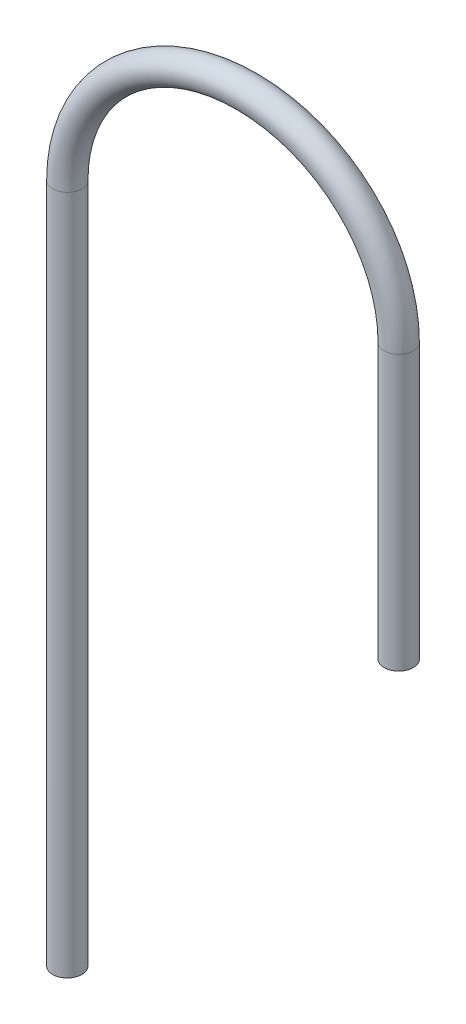
ISO-10303-21;
HEADER;
FILE_DESCRIPTION(('STEP AP214'),'2;1');
FILE_NAME('part.step','',(''),(''),'','','');
FILE_SCHEMA(('AUTOMOTIVE_DESIGN { 1 0 10303 214 1 1 1 1 }'));
ENDSEC;
DATA;
#1=APPLICATION_CONTEXT('core data for automotive mechanical design processes');
#2=APPLICATION_PROTOCOL_DEFINITION('international standard','automotive_design',2000,#1);
#3=PRODUCT_CONTEXT('',#1,'mechanical');
#4=PRODUCT('Part','Part','',(#3));
#5=PRODUCT_RELATED_PRODUCT_CATEGORY('part','',(#4));
#6=PRODUCT_DEFINITION_FORMATION('','',#4);
#7=PRODUCT_DEFINITION_CONTEXT('part definition',#1,'design');
#8=PRODUCT_DEFINITION('design','',#6,#7);
#9=PRODUCT_DEFINITION_SHAPE('','',#8);
#10=(LENGTH_UNIT() NAMED_UNIT(*) SI_UNIT(.MILLI.,.METRE.));
#11=(NAMED_UNIT(*) PLANE_ANGLE_UNIT() SI_UNIT($,.RADIAN.));
#12=(NAMED_UNIT(*) SI_UNIT($,.STERADIAN.) SOLID_ANGLE_UNIT());
#13=UNCERTAINTY_MEASURE_WITH_UNIT(LENGTH_MEASURE(1.E-05),#10,'distance_accuracy_value','');
#14=(GEOMETRIC_REPRESENTATION_CONTEXT(3) GLOBAL_UNCERTAINTY_ASSIGNED_CONTEXT((#13)) GLOBAL_UNIT_ASSIGNED_CONTEXT((#10,
#11,#12)) REPRESENTATION_CONTEXT('',''));
#15=CARTESIAN_POINT('',(0.,0.,0.));
#16=DIRECTION('',(0.,0.,1.));
#17=DIRECTION('',(1.,0.,0.));
#18=AXIS2_PLACEMENT_3D('',#15,#16,#17);
#19=CARTESIAN_POINT('',(-14.,165.,-59.25));
#20=DIRECTION('',(0.,-1.,0.));
#21=DIRECTION('',(0.165120370379971,0.,0.986273422173376));
#22=AXIS2_PLACEMENT_3D('',#19,#20,#21);
#23=PLANE('',#22);
#24=CARTESIAN_POINT('',(-14.,165.,-59.25));
#25=DIRECTION('',(0.,-1.,0.));
#26=DIRECTION('',(0.,0.,-1.));
#27=AXIS2_PLACEMENT_3D('',#24,#25,#26);
#28=CIRCLE('',#27,2.);
#29=CARTESIAN_POINT('',(-14.,165.,-61.25));
#30=VERTEX_POINT('',#29);
#31=EDGE_CURVE('E66',#30,#30,#28,.T.);
#32=ORIENTED_EDGE('',*,*,#31,.F.);
#33=EDGE_LOOP('',(#32));
#34=FACE_BOUND('',#33,.T.);
#35=CARTESIAN_POINT('',(-14.,165.,-59.25));
#36=DIRECTION('',(0.,-1.,0.));
#37=DIRECTION('',(0.165120370379971,0.,0.986273422173376));
#38=AXIS2_PLACEMENT_3D('',#35,#36,#37);
#39=CIRCLE('',#38,3.);
#40=CARTESIAN_POINT('',(-13.5046388888601,165.,-56.2911797334799));
#41=VERTEX_POINT('',#40);
#42=EDGE_CURVE('E57',#41,#41,#39,.T.);
#43=ORIENTED_EDGE('',*,*,#42,.T.);
#44=EDGE_LOOP('',(#43));
#45=FACE_BOUND('',#44,.T.);
#46=ADVANCED_FACE('F43',(#34,#45),#23,.T.);
#47=CARTESIAN_POINT('',(-76.8149247014594,81.6500000000002,-54.0281491126504));
#48=DIRECTION('',(0.,1.,0.));
#49=DIRECTION('',(0.,0.,1.));
#50=AXIS2_PLACEMENT_3D('',#47,#48,#49);
#51=PLANE('',#50);
#52=CARTESIAN_POINT('',(-76.8149247014594,81.6500000000002,-54.0281491126504));
#53=DIRECTION('',(0.,1.,0.));
#54=DIRECTION('',(0.,0.,1.));
#55=AXIS2_PLACEMENT_3D('',#52,#53,#54);
#56=CIRCLE('',#55,2.);
#57=CARTESIAN_POINT('',(-76.8149247014594,81.6500000000002,-52.0281491126504));
#58=VERTEX_POINT('',#57);
#59=EDGE_CURVE('E62',#58,#58,#56,.T.);
#60=ORIENTED_EDGE('',*,*,#59,.T.);
#61=EDGE_LOOP('',(#60));
#62=FACE_BOUND('',#61,.T.);
#63=CARTESIAN_POINT('',(-76.8149247014594,81.6500000000002,-54.0281491126504));
#64=DIRECTION('',(0.,1.,0.));
#65=DIRECTION('',(0.,0.,1.));
#66=AXIS2_PLACEMENT_3D('',#63,#64,#65);
#67=CIRCLE('',#66,3.);
#68=CARTESIAN_POINT('',(-76.8149247014594,81.6500000000002,-51.0281491126504));
#69=VERTEX_POINT('',#68);
#70=EDGE_CURVE('E11',#69,#69,#67,.T.);
#71=ORIENTED_EDGE('',*,*,#70,.F.);
#72=EDGE_LOOP('',(#71));
#73=FACE_BOUND('',#72,.T.);
#74=ADVANCED_FACE('F86',(#62,#73),#51,.F.);
#75=CARTESIAN_POINT('',(-14.,165.,-59.25));
#76=DIRECTION('',(0.,1.,0.));
#77=DIRECTION('',(0.,0.,1.));
#78=AXIS2_PLACEMENT_3D('',#75,#76,#77);
#79=CYLINDRICAL_SURFACE('',#78,3.);
#80=CARTESIAN_POINT('',(-14.,221.325,-59.25));
#81=DIRECTION('',(0.,-1.,0.));
#82=DIRECTION('',(0.165120370379971,0.,0.986273422173376));
#83=AXIS2_PLACEMENT_3D('',#80,#81,#82);
#84=CIRCLE('',#83,3.);
#85=CARTESIAN_POINT('',(-11.0103126585243,221.325,-59.4985349074472));
#86=VERTEX_POINT('',#85);
#87=EDGE_CURVE('E53',#86,#86,#84,.T.);
#88=ORIENTED_EDGE('',*,*,#87,.T.);
#89=EDGE_LOOP('',(#88));
#90=FACE_BOUND('',#89,.T.);
#91=ORIENTED_EDGE('',*,*,#42,.F.);
#92=EDGE_LOOP('',(#91));
#93=FACE_BOUND('',#92,.T.);
#94=ADVANCED_FACE('F90',(#90,#93),#79,.T.);
#95=CARTESIAN_POINT('',(-45.4074623507297,221.325,-56.6390745563252));
#96=DIRECTION('',(0.0828449691490815,0.,0.996562447158575));
#97=DIRECTION('',(0.996562447158575,0.,-0.0828449691490815));
#98=AXIS2_PLACEMENT_3D('',#95,#96,#97);
#99=TOROIDAL_SURFACE('',#98,31.5157995771158,3.);
#100=CARTESIAN_POINT('',(-76.8149247014594,221.325,-54.0281491126504));
#101=DIRECTION('',(0.,1.,0.));
#102=DIRECTION('',(0.,0.,1.));
#103=AXIS2_PLACEMENT_3D('',#100,#101,#102);
#104=CIRCLE('',#103,3.);
#105=CARTESIAN_POINT('',(-79.8046120429351,221.325,-53.7796142052032));
#106=VERTEX_POINT('',#105);
#107=EDGE_CURVE('E49',#106,#106,#104,.T.);
#108=CARTESIAN_POINT('',(-45.4074623507297,221.325,-56.6390745563252));
#109=DIRECTION('',(0.0828449691490815,0.,0.996562447158575));
#110=DIRECTION('',(0.996562447158575,0.,-0.0828449691490815));
#111=AXIS2_PLACEMENT_3D('',#108,#109,#110);
#112=CIRCLE('',#111,34.5157995771158);
#113=EDGE_CURVE('',#86,#106,#112,.T.);
#114=ORIENTED_EDGE('',*,*,#87,.F.);
#115=ORIENTED_EDGE('',*,*,#107,.T.);
#116=ORIENTED_EDGE('',*,*,#113,.T.);
#117=ORIENTED_EDGE('',*,*,#113,.F.);
#118=EDGE_LOOP('',(#114,#116,#115,#117));
#119=FACE_BOUND('',#118,.T.);
#120=ADVANCED_FACE('F92',(#119),#99,.T.);
#121=CARTESIAN_POINT('',(-76.8149247014594,221.325,-54.0281491126504));
#122=DIRECTION('',(0.,-1.,0.));
#123=DIRECTION('',(0.,0.,-1.));
#124=AXIS2_PLACEMENT_3D('',#121,#122,#123);
#125=CYLINDRICAL_SURFACE('',#124,3.);
#126=ORIENTED_EDGE('',*,*,#70,.T.);
#127=EDGE_LOOP('',(#126));
#128=FACE_BOUND('',#127,.T.);
#129=ORIENTED_EDGE('',*,*,#107,.F.);
#130=EDGE_LOOP('',(#129));
#131=FACE_BOUND('',#130,.T.);
#132=ADVANCED_FACE('F80',(#128,#131),#125,.T.);
#133=CARTESIAN_POINT('',(-14.,165.,-59.25));
#134=DIRECTION('',(0.,1.,0.));
#135=DIRECTION('',(0.,0.,1.));
#136=AXIS2_PLACEMENT_3D('',#133,#134,#135);
#137=CYLINDRICAL_SURFACE('',#136,2.);
#138=CARTESIAN_POINT('',(-14.,221.325,-59.25));
#139=DIRECTION('',(0.,1.,0.));
#140=DIRECTION('',(0.,0.,1.));
#141=AXIS2_PLACEMENT_3D('',#138,#139,#140);
#142=CIRCLE('',#141,2.);
#143=CARTESIAN_POINT('',(-12.0068751056829,221.325,-59.4156899382982));
#144=VERTEX_POINT('',#143);
#145=EDGE_CURVE('E69',#144,#144,#142,.F.);
#146=ORIENTED_EDGE('',*,*,#145,.F.);
#147=EDGE_LOOP('',(#146));
#148=FACE_BOUND('',#147,.T.);
#149=ORIENTED_EDGE('',*,*,#31,.T.);
#150=EDGE_LOOP('',(#149));
#151=FACE_BOUND('',#150,.T.);
#152=ADVANCED_FACE('F77',(#148,#151),#137,.F.);
#153=CARTESIAN_POINT('',(-45.4074623507297,221.325,-56.6390745563252));
#154=DIRECTION('',(0.0828449691490815,0.,0.996562447158575));
#155=DIRECTION('',(0.996562447158575,0.,-0.0828449691490815));
#156=AXIS2_PLACEMENT_3D('',#153,#154,#155);
#157=TOROIDAL_SURFACE('',#156,31.5157995771158,2.);
#158=CARTESIAN_POINT('',(-76.8149247014594,221.325,-54.0281491126504));
#159=DIRECTION('',(0.,1.,0.));
#160=DIRECTION('',(-1.,0.,0.));
#161=AXIS2_PLACEMENT_3D('',#158,#159,#160);
#162=CIRCLE('',#161,2.);
#163=CARTESIAN_POINT('',(-78.8080495957765,221.325,-53.8624591743522));
#164=VERTEX_POINT('',#163);
#165=EDGE_CURVE('E65',#164,#164,#162,.T.);
#166=CARTESIAN_POINT('',(-45.4074623507297,221.325,-56.6390745563252));
#167=DIRECTION('',(0.0828449691490815,0.,0.996562447158575));
#168=DIRECTION('',(0.996562447158575,0.,-0.0828449691490815));
#169=AXIS2_PLACEMENT_3D('',#166,#167,#168);
#170=CIRCLE('',#169,33.5157995771158);
#171=EDGE_CURVE('',#144,#164,#170,.T.);
#172=ORIENTED_EDGE('',*,*,#145,.T.);
#173=ORIENTED_EDGE('',*,*,#165,.F.);
#174=ORIENTED_EDGE('',*,*,#171,.T.);
#175=ORIENTED_EDGE('',*,*,#171,.F.);
#176=EDGE_LOOP('',(#172,#174,#173,#175));
#177=FACE_BOUND('',#176,.T.);
#178=ADVANCED_FACE('F75',(#177),#157,.F.);
#179=CARTESIAN_POINT('',(-76.8149247014594,221.325,-54.0281491126504));
#180=DIRECTION('',(0.,-1.,0.));
#181=DIRECTION('',(0.,0.,-1.));
#182=AXIS2_PLACEMENT_3D('',#179,#180,#181);
#183=CYLINDRICAL_SURFACE('',#182,2.);
#184=ORIENTED_EDGE('',*,*,#59,.F.);
#185=EDGE_LOOP('',(#184));
#186=FACE_BOUND('',#185,.T.);
#187=ORIENTED_EDGE('',*,*,#165,.T.);
#188=EDGE_LOOP('',(#187));
#189=FACE_BOUND('',#188,.T.);
#190=ADVANCED_FACE('F87',(#186,#189),#183,.F.);
#191=CLOSED_SHELL('',(#46,#74,#94,#120,#132,#152,#178,#190));
#192=MANIFOLD_SOLID_BREP('B2',#191);
#193=ADVANCED_BREP_SHAPE_REPRESENTATION('',(#18,#192),#14);
#194=SHAPE_DEFINITION_REPRESENTATION(#9,#193);
ENDSEC;
END-ISO-10303-21;
